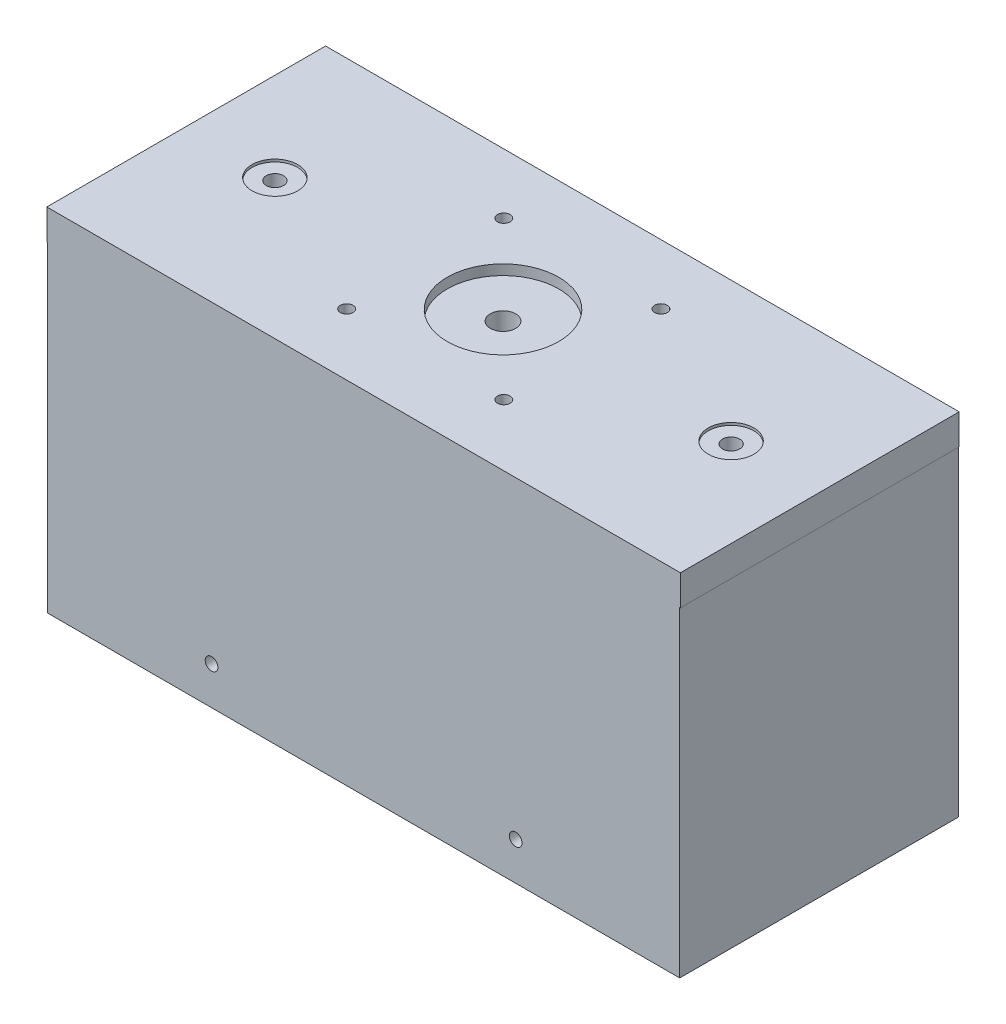
ISO-10303-21;
HEADER;
FILE_DESCRIPTION(('STEP AP214'),'2;1');
FILE_NAME('part.step','',(''),(''),'','','');
FILE_SCHEMA(('AUTOMOTIVE_DESIGN { 1 0 10303 214 1 1 1 1 }'));
ENDSEC;
DATA;
#1=APPLICATION_CONTEXT('core data for automotive mechanical design processes');
#2=APPLICATION_PROTOCOL_DEFINITION('international standard','automotive_design',2000,#1);
#3=PRODUCT_CONTEXT('',#1,'mechanical');
#4=PRODUCT('Part','Part','',(#3));
#5=PRODUCT_RELATED_PRODUCT_CATEGORY('part','',(#4));
#6=PRODUCT_DEFINITION_FORMATION('','',#4);
#7=PRODUCT_DEFINITION_CONTEXT('part definition',#1,'design');
#8=PRODUCT_DEFINITION('design','',#6,#7);
#9=PRODUCT_DEFINITION_SHAPE('','',#8);
#10=(LENGTH_UNIT() NAMED_UNIT(*) SI_UNIT(.MILLI.,.METRE.));
#11=(NAMED_UNIT(*) PLANE_ANGLE_UNIT() SI_UNIT($,.RADIAN.));
#12=(NAMED_UNIT(*) SI_UNIT($,.STERADIAN.) SOLID_ANGLE_UNIT());
#13=UNCERTAINTY_MEASURE_WITH_UNIT(LENGTH_MEASURE(1.E-05),#10,'distance_accuracy_value','');
#14=(GEOMETRIC_REPRESENTATION_CONTEXT(3) GLOBAL_UNCERTAINTY_ASSIGNED_CONTEXT((#13)) GLOBAL_UNIT_ASSIGNED_CONTEXT((#10,
#11,#12)) REPRESENTATION_CONTEXT('',''));
#15=CARTESIAN_POINT('',(0.,0.,0.));
#16=DIRECTION('',(0.,0.,1.));
#17=DIRECTION('',(1.,0.,0.));
#18=AXIS2_PLACEMENT_3D('',#15,#16,#17);
#19=CARTESIAN_POINT('',(-62.5,6.,27.5));
#20=DIRECTION('',(0.,0.,-1.));
#21=DIRECTION('',(-1.,0.,0.));
#22=AXIS2_PLACEMENT_3D('',#19,#20,#21);
#23=PLANE('',#22);
#24=DIRECTION('',(1.,0.,0.));
#25=VECTOR('',#24,1.);
#26=CARTESIAN_POINT('',(-62.5,0.,27.5));
#27=LINE('',#26,#25);
#28=CARTESIAN_POINT('',(-62.5,0.,27.5));
#29=VERTEX_POINT('',#28);
#30=CARTESIAN_POINT('',(-62.3619957512327,0.,27.5));
#31=VERTEX_POINT('',#30);
#32=EDGE_CURVE('E231',#29,#31,#27,.T.);
#33=ORIENTED_EDGE('',*,*,#32,.T.);
#34=DIRECTION('',(0.,1.,0.));
#35=VECTOR('',#34,1.);
#36=CARTESIAN_POINT('',(-62.3619957512327,-63.3064191724175,27.5));
#37=LINE('',#36,#35);
#38=CARTESIAN_POINT('',(-62.3619957512327,-63.3064191724175,27.5));
#39=VERTEX_POINT('',#38);
#40=EDGE_CURVE('E183',#39,#31,#37,.T.);
#41=ORIENTED_EDGE('',*,*,#40,.F.);
#42=DIRECTION('',(-1.,0.,0.));
#43=VECTOR('',#42,1.);
#44=CARTESIAN_POINT('',(62.3619957512328,-63.3064191724175,27.5));
#45=LINE('',#44,#43);
#46=CARTESIAN_POINT('',(62.3619957512328,-63.3064191724175,27.5));
#47=VERTEX_POINT('',#46);
#48=EDGE_CURVE('E181',#47,#39,#45,.T.);
#49=ORIENTED_EDGE('',*,*,#48,.F.);
#50=DIRECTION('',(0.,1.,0.));
#51=VECTOR('',#50,1.);
#52=CARTESIAN_POINT('',(62.3619957512328,-63.3064191724175,27.5));
#53=LINE('',#52,#51);
#54=CARTESIAN_POINT('',(62.3619957512328,0.,27.5));
#55=VERTEX_POINT('',#54);
#56=EDGE_CURVE('E190',#47,#55,#53,.T.);
#57=ORIENTED_EDGE('',*,*,#56,.T.);
#58=CARTESIAN_POINT('',(62.5,0.,27.5));
#59=VERTEX_POINT('',#58);
#60=EDGE_CURVE('E245',#55,#59,#27,.T.);
#61=ORIENTED_EDGE('',*,*,#60,.T.);
#62=DIRECTION('',(0.,-1.,0.));
#63=VECTOR('',#62,1.);
#64=CARTESIAN_POINT('',(62.5,6.,27.5));
#65=LINE('',#64,#63);
#66=CARTESIAN_POINT('',(62.5,6.,27.5));
#67=VERTEX_POINT('',#66);
#68=EDGE_CURVE('E237',#67,#59,#65,.T.);
#69=ORIENTED_EDGE('',*,*,#68,.F.);
#70=DIRECTION('',(1.,0.,0.));
#71=VECTOR('',#70,1.);
#72=CARTESIAN_POINT('',(-62.5,6.,27.5));
#73=LINE('',#72,#71);
#74=CARTESIAN_POINT('',(-62.5,6.,27.5));
#75=VERTEX_POINT('',#74);
#76=EDGE_CURVE('E235',#75,#67,#73,.T.);
#77=ORIENTED_EDGE('',*,*,#76,.F.);
#78=DIRECTION('',(0.,-1.,0.));
#79=VECTOR('',#78,1.);
#80=CARTESIAN_POINT('',(-62.5,6.,27.5));
#81=LINE('',#80,#79);
#82=EDGE_CURVE('E250',#75,#29,#81,.T.);
#83=ORIENTED_EDGE('',*,*,#82,.T.);
#84=EDGE_LOOP('',(#33,#41,#49,#57,#61,#69,#77,#83));
#85=FACE_BOUND('',#84,.T.);
#86=CARTESIAN_POINT('',(-30.,-55.8064191724175,27.5));
#87=DIRECTION('',(0.,0.,1.));
#88=DIRECTION('',(1.,0.,0.));
#89=AXIS2_PLACEMENT_3D('',#86,#87,#88);
#90=CIRCLE('',#89,1.24999999999999);
#91=CARTESIAN_POINT('',(-28.75,-55.8064191724175,27.5));
#92=VERTEX_POINT('',#91);
#93=EDGE_CURVE('E283',#92,#92,#90,.T.);
#94=ORIENTED_EDGE('',*,*,#93,.F.);
#95=EDGE_LOOP('',(#94));
#96=FACE_BOUND('',#95,.T.);
#97=CARTESIAN_POINT('',(30.,-55.8064191724175,27.5));
#98=DIRECTION('',(0.,0.,1.));
#99=DIRECTION('',(1.,0.,0.));
#100=AXIS2_PLACEMENT_3D('',#97,#98,#99);
#101=CIRCLE('',#100,1.24999999999999);
#102=CARTESIAN_POINT('',(31.25,-55.8064191724175,27.5));
#103=VERTEX_POINT('',#102);
#104=EDGE_CURVE('E264',#103,#103,#101,.T.);
#105=ORIENTED_EDGE('',*,*,#104,.F.);
#106=EDGE_LOOP('',(#105));
#107=FACE_BOUND('',#106,.T.);
#108=ADVANCED_FACE('F39',(#85,#96,#107),#23,.F.);
#109=CARTESIAN_POINT('',(-62.5,6.,-27.5));
#110=DIRECTION('',(0.,0.,1.));
#111=DIRECTION('',(1.,0.,0.));
#112=AXIS2_PLACEMENT_3D('',#109,#110,#111);
#113=PLANE('',#112);
#114=DIRECTION('',(-1.,0.,0.));
#115=VECTOR('',#114,1.);
#116=CARTESIAN_POINT('',(-62.5,0.,-27.5));
#117=LINE('',#116,#115);
#118=CARTESIAN_POINT('',(62.5,0.,-27.5));
#119=VERTEX_POINT('',#118);
#120=CARTESIAN_POINT('',(62.3619957512328,0.,-27.5));
#121=VERTEX_POINT('',#120);
#122=EDGE_CURVE('E240',#119,#121,#117,.T.);
#123=ORIENTED_EDGE('',*,*,#122,.T.);
#124=DIRECTION('',(0.,1.,0.));
#125=VECTOR('',#124,1.);
#126=CARTESIAN_POINT('',(62.3619957512328,-63.3064191724175,-27.5));
#127=LINE('',#126,#125);
#128=CARTESIAN_POINT('',(62.3619957512328,-63.3064191724175,-27.5));
#129=VERTEX_POINT('',#128);
#130=EDGE_CURVE('E193',#129,#121,#127,.T.);
#131=ORIENTED_EDGE('',*,*,#130,.F.);
#132=DIRECTION('',(1.,0.,0.));
#133=VECTOR('',#132,1.);
#134=CARTESIAN_POINT('',(62.3619957512328,-63.3064191724175,-27.5));
#135=LINE('',#134,#133);
#136=CARTESIAN_POINT('',(-62.3619957512327,-63.3064191724175,-27.5));
#137=VERTEX_POINT('',#136);
#138=EDGE_CURVE('E176',#137,#129,#135,.T.);
#139=ORIENTED_EDGE('',*,*,#138,.F.);
#140=DIRECTION('',(0.,1.,0.));
#141=VECTOR('',#140,1.);
#142=CARTESIAN_POINT('',(-62.3619957512327,-63.3064191724175,-27.5));
#143=LINE('',#142,#141);
#144=CARTESIAN_POINT('',(-62.3619957512327,0.,-27.5));
#145=VERTEX_POINT('',#144);
#146=EDGE_CURVE('E196',#137,#145,#143,.T.);
#147=ORIENTED_EDGE('',*,*,#146,.T.);
#148=CARTESIAN_POINT('',(-62.5,0.,-27.5));
#149=VERTEX_POINT('',#148);
#150=EDGE_CURVE('E64',#145,#149,#117,.T.);
#151=ORIENTED_EDGE('',*,*,#150,.T.);
#152=DIRECTION('',(0.,-1.,0.));
#153=VECTOR('',#152,1.);
#154=CARTESIAN_POINT('',(-62.5,6.,-27.5));
#155=LINE('',#154,#153);
#156=CARTESIAN_POINT('',(-62.5,6.,-27.5));
#157=VERTEX_POINT('',#156);
#158=EDGE_CURVE('E48',#157,#149,#155,.T.);
#159=ORIENTED_EDGE('',*,*,#158,.F.);
#160=DIRECTION('',(-1.,0.,0.));
#161=VECTOR('',#160,1.);
#162=CARTESIAN_POINT('',(-62.5,6.,-27.5));
#163=LINE('',#162,#161);
#164=CARTESIAN_POINT('',(62.5,6.,-27.5));
#165=VERTEX_POINT('',#164);
#166=EDGE_CURVE('E230',#165,#157,#163,.T.);
#167=ORIENTED_EDGE('',*,*,#166,.F.);
#168=DIRECTION('',(0.,-1.,0.));
#169=VECTOR('',#168,1.);
#170=CARTESIAN_POINT('',(62.5,6.,-27.5));
#171=LINE('',#170,#169);
#172=EDGE_CURVE('E11',#165,#119,#171,.T.);
#173=ORIENTED_EDGE('',*,*,#172,.T.);
#174=EDGE_LOOP('',(#123,#131,#139,#147,#151,#159,#167,#173));
#175=FACE_BOUND('',#174,.T.);
#176=CARTESIAN_POINT('',(30.,-55.8064191724175,-27.5));
#177=DIRECTION('',(0.,0.,-1.));
#178=DIRECTION('',(-1.,0.,0.));
#179=AXIS2_PLACEMENT_3D('',#176,#177,#178);
#180=CIRCLE('',#179,1.24999999999999);
#181=CARTESIAN_POINT('',(28.75,-55.8064191724175,-27.5));
#182=VERTEX_POINT('',#181);
#183=EDGE_CURVE('E295',#182,#182,#180,.T.);
#184=ORIENTED_EDGE('',*,*,#183,.F.);
#185=EDGE_LOOP('',(#184));
#186=FACE_BOUND('',#185,.T.);
#187=CARTESIAN_POINT('',(-30.,-55.8064191724175,-27.5));
#188=DIRECTION('',(0.,0.,-1.));
#189=DIRECTION('',(-1.,0.,0.));
#190=AXIS2_PLACEMENT_3D('',#187,#188,#189);
#191=CIRCLE('',#190,1.24999999999999);
#192=CARTESIAN_POINT('',(-31.25,-55.8064191724175,-27.5));
#193=VERTEX_POINT('',#192);
#194=EDGE_CURVE('E289',#193,#193,#191,.T.);
#195=ORIENTED_EDGE('',*,*,#194,.F.);
#196=EDGE_LOOP('',(#195));
#197=FACE_BOUND('',#196,.T.);
#198=ADVANCED_FACE('F317',(#175,#186,#197),#113,.F.);
#199=CARTESIAN_POINT('',(0.,0.,0.));
#200=DIRECTION('',(0.,1.,0.));
#201=DIRECTION('',(0.,0.,1.));
#202=AXIS2_PLACEMENT_3D('',#199,#200,#201);
#203=PLANE('',#202);
#204=DIRECTION('',(0.,0.,-1.));
#205=VECTOR('',#204,1.);
#206=CARTESIAN_POINT('',(-62.3619957512327,0.,-27.5));
#207=LINE('',#206,#205);
#208=EDGE_CURVE('E147',#31,#145,#207,.T.);
#209=ORIENTED_EDGE('',*,*,#208,.F.);
#210=ORIENTED_EDGE('',*,*,#32,.F.);
#211=DIRECTION('',(0.,0.,1.));
#212=VECTOR('',#211,1.);
#213=CARTESIAN_POINT('',(-62.5,0.,-27.5));
#214=LINE('',#213,#212);
#215=EDGE_CURVE('E243',#149,#29,#214,.T.);
#216=ORIENTED_EDGE('',*,*,#215,.F.);
#217=ORIENTED_EDGE('',*,*,#150,.F.);
#218=EDGE_LOOP('',(#209,#210,#216,#217));
#219=FACE_BOUND('',#218,.T.);
#220=ADVANCED_FACE('F323',(#219),#203,.F.);
#221=DIRECTION('',(0.,0.,1.));
#222=VECTOR('',#221,1.);
#223=CARTESIAN_POINT('',(62.3619957512328,0.,-27.5));
#224=LINE('',#223,#222);
#225=EDGE_CURVE('E177',#121,#55,#224,.T.);
#226=ORIENTED_EDGE('',*,*,#225,.F.);
#227=ORIENTED_EDGE('',*,*,#122,.F.);
#228=DIRECTION('',(0.,0.,-1.));
#229=VECTOR('',#228,1.);
#230=CARTESIAN_POINT('',(62.5,0.,-27.5));
#231=LINE('',#230,#229);
#232=EDGE_CURVE('E224',#59,#119,#231,.T.);
#233=ORIENTED_EDGE('',*,*,#232,.F.);
#234=ORIENTED_EDGE('',*,*,#60,.F.);
#235=EDGE_LOOP('',(#226,#227,#233,#234));
#236=FACE_BOUND('',#235,.T.);
#237=ADVANCED_FACE('F339',(#236),#203,.F.);
#238=CARTESIAN_POINT('',(62.5,6.,-27.5));
#239=DIRECTION('',(-1.,0.,0.));
#240=DIRECTION('',(0.,0.,1.));
#241=AXIS2_PLACEMENT_3D('',#238,#239,#240);
#242=PLANE('',#241);
#243=ORIENTED_EDGE('',*,*,#232,.T.);
#244=ORIENTED_EDGE('',*,*,#172,.F.);
#245=DIRECTION('',(0.,0.,-1.));
#246=VECTOR('',#245,1.);
#247=CARTESIAN_POINT('',(62.5,6.,-27.5));
#248=LINE('',#247,#246);
#249=EDGE_CURVE('E227',#67,#165,#248,.T.);
#250=ORIENTED_EDGE('',*,*,#249,.F.);
#251=ORIENTED_EDGE('',*,*,#68,.T.);
#252=EDGE_LOOP('',(#243,#244,#250,#251));
#253=FACE_BOUND('',#252,.T.);
#254=ADVANCED_FACE('F41',(#253),#242,.F.);
#255=CARTESIAN_POINT('',(-62.5,6.,-27.5));
#256=DIRECTION('',(1.,0.,0.));
#257=DIRECTION('',(0.,0.,-1.));
#258=AXIS2_PLACEMENT_3D('',#255,#256,#257);
#259=PLANE('',#258);
#260=ORIENTED_EDGE('',*,*,#215,.T.);
#261=ORIENTED_EDGE('',*,*,#82,.F.);
#262=DIRECTION('',(0.,0.,1.));
#263=VECTOR('',#262,1.);
#264=CARTESIAN_POINT('',(-62.5,6.,-27.5));
#265=LINE('',#264,#263);
#266=EDGE_CURVE('E233',#157,#75,#265,.T.);
#267=ORIENTED_EDGE('',*,*,#266,.F.);
#268=ORIENTED_EDGE('',*,*,#158,.T.);
#269=EDGE_LOOP('',(#260,#261,#267,#268));
#270=FACE_BOUND('',#269,.T.);
#271=ADVANCED_FACE('F330',(#270),#259,.F.);
#272=CARTESIAN_POINT('',(0.,6.,0.));
#273=DIRECTION('',(0.,1.,0.));
#274=DIRECTION('',(0.,0.,1.));
#275=AXIS2_PLACEMENT_3D('',#272,#273,#274);
#276=PLANE('',#275);
#277=CARTESIAN_POINT('',(-45.,6.,0.));
#278=DIRECTION('',(0.,1.,0.));
#279=DIRECTION('',(0.,0.,1.));
#280=AXIS2_PLACEMENT_3D('',#277,#278,#279);
#281=CIRCLE('',#280,4.49999999999999);
#282=CARTESIAN_POINT('',(-45.,6.,4.5));
#283=VERTEX_POINT('',#282);
#284=EDGE_CURVE('E695',#283,#283,#281,.T.);
#285=ORIENTED_EDGE('',*,*,#284,.F.);
#286=EDGE_LOOP('',(#285));
#287=FACE_BOUND('',#286,.T.);
#288=CARTESIAN_POINT('',(45.,6.,0.));
#289=DIRECTION('',(0.,1.,0.));
#290=DIRECTION('',(0.,0.,1.));
#291=AXIS2_PLACEMENT_3D('',#288,#289,#290);
#292=CIRCLE('',#291,4.49999999999999);
#293=CARTESIAN_POINT('',(45.,6.,4.49999999999999));
#294=VERTEX_POINT('',#293);
#295=EDGE_CURVE('E705',#294,#294,#292,.T.);
#296=ORIENTED_EDGE('',*,*,#295,.F.);
#297=EDGE_LOOP('',(#296));
#298=FACE_BOUND('',#297,.T.);
#299=CARTESIAN_POINT('',(15.5,6.,-15.657432452083));
#300=DIRECTION('',(0.,1.,0.));
#301=DIRECTION('',(0.,0.,1.));
#302=AXIS2_PLACEMENT_3D('',#299,#300,#301);
#303=CIRCLE('',#302,1.24999999999999);
#304=CARTESIAN_POINT('',(15.5,6.,-14.407432452083));
#305=VERTEX_POINT('',#304);
#306=EDGE_CURVE('E198',#305,#305,#303,.T.);
#307=ORIENTED_EDGE('',*,*,#306,.F.);
#308=EDGE_LOOP('',(#307));
#309=FACE_BOUND('',#308,.T.);
#310=CARTESIAN_POINT('',(15.5,6.,15.342567547917));
#311=DIRECTION('',(0.,1.,0.));
#312=DIRECTION('',(0.,0.,1.));
#313=AXIS2_PLACEMENT_3D('',#310,#311,#312);
#314=CIRCLE('',#313,1.24999999999999);
#315=CARTESIAN_POINT('',(15.5,6.,16.592567547917));
#316=VERTEX_POINT('',#315);
#317=EDGE_CURVE('E202',#316,#316,#314,.T.);
#318=ORIENTED_EDGE('',*,*,#317,.F.);
#319=EDGE_LOOP('',(#318));
#320=FACE_BOUND('',#319,.T.);
#321=CARTESIAN_POINT('',(-15.5,6.,15.342567547917));
#322=DIRECTION('',(0.,1.,0.));
#323=DIRECTION('',(0.,0.,1.));
#324=AXIS2_PLACEMENT_3D('',#321,#322,#323);
#325=CIRCLE('',#324,1.24999999999999);
#326=CARTESIAN_POINT('',(-15.5,6.,16.592567547917));
#327=VERTEX_POINT('',#326);
#328=EDGE_CURVE('E206',#327,#327,#325,.T.);
#329=ORIENTED_EDGE('',*,*,#328,.F.);
#330=EDGE_LOOP('',(#329));
#331=FACE_BOUND('',#330,.T.);
#332=CARTESIAN_POINT('',(-15.5,6.,-15.657432452083));
#333=DIRECTION('',(0.,1.,0.));
#334=DIRECTION('',(0.,0.,1.));
#335=AXIS2_PLACEMENT_3D('',#332,#333,#334);
#336=CIRCLE('',#335,1.24999999999999);
#337=CARTESIAN_POINT('',(-15.5,6.,-14.407432452083));
#338=VERTEX_POINT('',#337);
#339=EDGE_CURVE('E210',#338,#338,#336,.T.);
#340=ORIENTED_EDGE('',*,*,#339,.F.);
#341=EDGE_LOOP('',(#340));
#342=FACE_BOUND('',#341,.T.);
#343=CARTESIAN_POINT('',(0.,6.,0.));
#344=DIRECTION('',(0.,1.,0.));
#345=DIRECTION('',(0.,0.,1.));
#346=AXIS2_PLACEMENT_3D('',#343,#344,#345);
#347=CIRCLE('',#346,11.);
#348=CARTESIAN_POINT('',(0.,6.,11.));
#349=VERTEX_POINT('',#348);
#350=EDGE_CURVE('E220',#349,#349,#347,.T.);
#351=ORIENTED_EDGE('',*,*,#350,.F.);
#352=EDGE_LOOP('',(#351));
#353=FACE_BOUND('',#352,.T.);
#354=ORIENTED_EDGE('',*,*,#249,.T.);
#355=ORIENTED_EDGE('',*,*,#166,.T.);
#356=ORIENTED_EDGE('',*,*,#266,.T.);
#357=ORIENTED_EDGE('',*,*,#76,.T.);
#358=EDGE_LOOP('',(#354,#355,#356,#357));
#359=FACE_BOUND('',#358,.T.);
#360=ADVANCED_FACE('F332',(#287,#298,#309,#320,#331,#342,#353,#359),#276,.T.);
#361=CARTESIAN_POINT('',(-45.,0.,0.));
#362=DIRECTION('',(0.,1.,0.));
#363=DIRECTION('',(0.,0.,1.));
#364=AXIS2_PLACEMENT_3D('',#361,#362,#363);
#365=CIRCLE('',#364,0.0357205176494837);
#366=CARTESIAN_POINT('',(-45.,0.,0.0357205176494893));
#367=VERTEX_POINT('',#366);
#368=EDGE_CURVE('E43',#367,#367,#365,.T.);
#369=ORIENTED_EDGE('',*,*,#368,.T.);
#370=EDGE_LOOP('',(#369));
#371=FACE_BOUND('',#370,.T.);
#372=CARTESIAN_POINT('',(45.,0.,0.));
#373=DIRECTION('',(0.,1.,0.));
#374=DIRECTION('',(0.,0.,1.));
#375=AXIS2_PLACEMENT_3D('',#372,#373,#374);
#376=CIRCLE('',#375,0.0357205176494837);
#377=CARTESIAN_POINT('',(45.,0.,0.0357205176494838));
#378=VERTEX_POINT('',#377);
#379=EDGE_CURVE('E262',#378,#378,#376,.T.);
#380=ORIENTED_EDGE('',*,*,#379,.T.);
#381=EDGE_LOOP('',(#380));
#382=FACE_BOUND('',#381,.T.);
#383=DIRECTION('',(-1.,0.,0.));
#384=VECTOR('',#383,1.);
#385=CARTESIAN_POINT('',(60.,0.,24.842567547917));
#386=LINE('',#385,#384);
#387=CARTESIAN_POINT('',(60.,0.,24.842567547917));
#388=VERTEX_POINT('',#387);
#389=CARTESIAN_POINT('',(-60.,0.,24.842567547917));
#390=VERTEX_POINT('',#389);
#391=EDGE_CURVE('E140',#388,#390,#386,.T.);
#392=ORIENTED_EDGE('',*,*,#391,.T.);
#393=DIRECTION('',(0.,0.,-1.));
#394=VECTOR('',#393,1.);
#395=CARTESIAN_POINT('',(-60.,0.,-24.842567547917));
#396=LINE('',#395,#394);
#397=CARTESIAN_POINT('',(-60.,0.,-24.842567547917));
#398=VERTEX_POINT('',#397);
#399=EDGE_CURVE('E160',#390,#398,#396,.T.);
#400=ORIENTED_EDGE('',*,*,#399,.T.);
#401=DIRECTION('',(1.,0.,0.));
#402=VECTOR('',#401,1.);
#403=CARTESIAN_POINT('',(60.,0.,-24.842567547917));
#404=LINE('',#403,#402);
#405=CARTESIAN_POINT('',(60.,0.,-24.842567547917));
#406=VERTEX_POINT('',#405);
#407=EDGE_CURVE('E146',#398,#406,#404,.T.);
#408=ORIENTED_EDGE('',*,*,#407,.T.);
#409=DIRECTION('',(0.,0.,1.));
#410=VECTOR('',#409,1.);
#411=CARTESIAN_POINT('',(60.,0.,-24.842567547917));
#412=LINE('',#411,#410);
#413=EDGE_CURVE('E164',#406,#388,#412,.T.);
#414=ORIENTED_EDGE('',*,*,#413,.T.);
#415=EDGE_LOOP('',(#392,#400,#408,#414));
#416=FACE_BOUND('',#415,.T.);
#417=CARTESIAN_POINT('',(15.5,0.,-15.657432452083));
#418=DIRECTION('',(0.,1.,0.));
#419=DIRECTION('',(0.,0.,1.));
#420=AXIS2_PLACEMENT_3D('',#417,#418,#419);
#421=CIRCLE('',#420,1.24999999999999);
#422=CARTESIAN_POINT('',(15.5,0.,-14.407432452083));
#423=VERTEX_POINT('',#422);
#424=EDGE_CURVE('E201',#423,#423,#421,.T.);
#425=ORIENTED_EDGE('',*,*,#424,.T.);
#426=EDGE_LOOP('',(#425));
#427=FACE_BOUND('',#426,.T.);
#428=CARTESIAN_POINT('',(15.5,0.,15.342567547917));
#429=DIRECTION('',(0.,1.,0.));
#430=DIRECTION('',(0.,0.,1.));
#431=AXIS2_PLACEMENT_3D('',#428,#429,#430);
#432=CIRCLE('',#431,1.24999999999999);
#433=CARTESIAN_POINT('',(15.5,0.,16.592567547917));
#434=VERTEX_POINT('',#433);
#435=EDGE_CURVE('E205',#434,#434,#432,.T.);
#436=ORIENTED_EDGE('',*,*,#435,.T.);
#437=EDGE_LOOP('',(#436));
#438=FACE_BOUND('',#437,.T.);
#439=CARTESIAN_POINT('',(-15.5,0.,15.342567547917));
#440=DIRECTION('',(0.,1.,0.));
#441=DIRECTION('',(0.,0.,1.));
#442=AXIS2_PLACEMENT_3D('',#439,#440,#441);
#443=CIRCLE('',#442,1.24999999999999);
#444=CARTESIAN_POINT('',(-15.5,0.,16.592567547917));
#445=VERTEX_POINT('',#444);
#446=EDGE_CURVE('E209',#445,#445,#443,.T.);
#447=ORIENTED_EDGE('',*,*,#446,.T.);
#448=EDGE_LOOP('',(#447));
#449=FACE_BOUND('',#448,.T.);
#450=CARTESIAN_POINT('',(-15.5,0.,-15.657432452083));
#451=DIRECTION('',(0.,1.,0.));
#452=DIRECTION('',(0.,0.,1.));
#453=AXIS2_PLACEMENT_3D('',#450,#451,#452);
#454=CIRCLE('',#453,1.24999999999999);
#455=CARTESIAN_POINT('',(-15.5,0.,-14.407432452083));
#456=VERTEX_POINT('',#455);
#457=EDGE_CURVE('E213',#456,#456,#454,.T.);
#458=ORIENTED_EDGE('',*,*,#457,.T.);
#459=EDGE_LOOP('',(#458));
#460=FACE_BOUND('',#459,.T.);
#461=CARTESIAN_POINT('',(0.,0.,0.));
#462=DIRECTION('',(0.,1.,0.));
#463=DIRECTION('',(0.,0.,1.));
#464=AXIS2_PLACEMENT_3D('',#461,#462,#463);
#465=CIRCLE('',#464,2.5);
#466=CARTESIAN_POINT('',(0.,0.,2.5));
#467=VERTEX_POINT('',#466);
#468=EDGE_CURVE('E217',#467,#467,#465,.F.);
#469=ORIENTED_EDGE('',*,*,#468,.F.);
#470=EDGE_LOOP('',(#469));
#471=FACE_BOUND('',#470,.T.);
#472=ADVANCED_FACE('F328',(#371,#382,#416,#427,#438,#449,#460,#471),#203,.F.);
#473=CARTESIAN_POINT('',(0.,4.,0.));
#474=DIRECTION('',(0.,1.,0.));
#475=DIRECTION('',(0.,0.,1.));
#476=AXIS2_PLACEMENT_3D('',#473,#474,#475);
#477=CYLINDRICAL_SURFACE('',#476,11.);
#478=CARTESIAN_POINT('',(0.,4.,0.));
#479=DIRECTION('',(0.,1.,0.));
#480=DIRECTION('',(0.,0.,1.));
#481=AXIS2_PLACEMENT_3D('',#478,#479,#480);
#482=CIRCLE('',#481,11.);
#483=CARTESIAN_POINT('',(0.,4.,11.));
#484=VERTEX_POINT('',#483);
#485=EDGE_CURVE('E221',#484,#484,#482,.T.);
#486=ORIENTED_EDGE('',*,*,#485,.F.);
#487=EDGE_LOOP('',(#486));
#488=FACE_BOUND('',#487,.T.);
#489=ORIENTED_EDGE('',*,*,#350,.T.);
#490=EDGE_LOOP('',(#489));
#491=FACE_BOUND('',#490,.T.);
#492=ADVANCED_FACE('F395',(#488,#491),#477,.F.);
#493=CARTESIAN_POINT('',(0.,4.,0.));
#494=DIRECTION('',(0.,1.,0.));
#495=DIRECTION('',(0.,0.,1.));
#496=AXIS2_PLACEMENT_3D('',#493,#494,#495);
#497=PLANE('',#496);
#498=CARTESIAN_POINT('',(0.,4.,0.));
#499=DIRECTION('',(0.,1.,0.));
#500=DIRECTION('',(0.,0.,1.));
#501=AXIS2_PLACEMENT_3D('',#498,#499,#500);
#502=CIRCLE('',#501,2.5);
#503=CARTESIAN_POINT('',(0.,4.,2.5));
#504=VERTEX_POINT('',#503);
#505=EDGE_CURVE('E214',#504,#504,#502,.T.);
#506=ORIENTED_EDGE('',*,*,#505,.F.);
#507=EDGE_LOOP('',(#506));
#508=FACE_BOUND('',#507,.T.);
#509=ORIENTED_EDGE('',*,*,#485,.T.);
#510=EDGE_LOOP('',(#509));
#511=FACE_BOUND('',#510,.T.);
#512=ADVANCED_FACE('F410',(#508,#511),#497,.T.);
#513=CARTESIAN_POINT('',(0.,-0.00100000000000013,0.));
#514=DIRECTION('',(0.,1.,0.));
#515=DIRECTION('',(0.,0.,1.));
#516=AXIS2_PLACEMENT_3D('',#513,#514,#515);
#517=CYLINDRICAL_SURFACE('',#516,2.5);
#518=ORIENTED_EDGE('',*,*,#505,.T.);
#519=EDGE_LOOP('',(#518));
#520=FACE_BOUND('',#519,.T.);
#521=ORIENTED_EDGE('',*,*,#468,.T.);
#522=EDGE_LOOP('',(#521));
#523=FACE_BOUND('',#522,.T.);
#524=ADVANCED_FACE('F407',(#520,#523),#517,.F.);
#525=CARTESIAN_POINT('',(-15.5,6.,-15.657432452083));
#526=DIRECTION('',(0.,1.,0.));
#527=DIRECTION('',(0.,0.,1.));
#528=AXIS2_PLACEMENT_3D('',#525,#526,#527);
#529=CYLINDRICAL_SURFACE('',#528,1.24999999999999);
#530=ORIENTED_EDGE('',*,*,#339,.T.);
#531=EDGE_LOOP('',(#530));
#532=FACE_BOUND('',#531,.T.);
#533=ORIENTED_EDGE('',*,*,#457,.F.);
#534=EDGE_LOOP('',(#533));
#535=FACE_BOUND('',#534,.T.);
#536=ADVANCED_FACE('F409',(#532,#535),#529,.F.);
#537=CARTESIAN_POINT('',(-15.5,6.,15.342567547917));
#538=DIRECTION('',(0.,1.,0.));
#539=DIRECTION('',(0.,0.,1.));
#540=AXIS2_PLACEMENT_3D('',#537,#538,#539);
#541=CYLINDRICAL_SURFACE('',#540,1.24999999999999);
#542=ORIENTED_EDGE('',*,*,#328,.T.);
#543=EDGE_LOOP('',(#542));
#544=FACE_BOUND('',#543,.T.);
#545=ORIENTED_EDGE('',*,*,#446,.F.);
#546=EDGE_LOOP('',(#545));
#547=FACE_BOUND('',#546,.T.);
#548=ADVANCED_FACE('F417',(#544,#547),#541,.F.);
#549=CARTESIAN_POINT('',(15.5,6.,15.342567547917));
#550=DIRECTION('',(0.,1.,0.));
#551=DIRECTION('',(0.,0.,1.));
#552=AXIS2_PLACEMENT_3D('',#549,#550,#551);
#553=CYLINDRICAL_SURFACE('',#552,1.24999999999999);
#554=ORIENTED_EDGE('',*,*,#317,.T.);
#555=EDGE_LOOP('',(#554));
#556=FACE_BOUND('',#555,.T.);
#557=ORIENTED_EDGE('',*,*,#435,.F.);
#558=EDGE_LOOP('',(#557));
#559=FACE_BOUND('',#558,.T.);
#560=ADVANCED_FACE('F461',(#556,#559),#553,.F.);
#561=CARTESIAN_POINT('',(15.5,6.,-15.657432452083));
#562=DIRECTION('',(0.,1.,0.));
#563=DIRECTION('',(0.,0.,1.));
#564=AXIS2_PLACEMENT_3D('',#561,#562,#563);
#565=CYLINDRICAL_SURFACE('',#564,1.24999999999999);
#566=ORIENTED_EDGE('',*,*,#306,.T.);
#567=EDGE_LOOP('',(#566));
#568=FACE_BOUND('',#567,.T.);
#569=ORIENTED_EDGE('',*,*,#424,.F.);
#570=EDGE_LOOP('',(#569));
#571=FACE_BOUND('',#570,.T.);
#572=ADVANCED_FACE('F472',(#568,#571),#565,.F.);
#573=CARTESIAN_POINT('',(0.,-63.3064191724175,0.));
#574=DIRECTION('',(0.,-1.,0.));
#575=DIRECTION('',(0.,0.,-1.));
#576=AXIS2_PLACEMENT_3D('',#573,#574,#575);
#577=PLANE('',#576);
#578=DIRECTION('',(0.,0.,-1.));
#579=VECTOR('',#578,1.);
#580=CARTESIAN_POINT('',(-62.3619957512327,-63.3064191724175,-27.5));
#581=LINE('',#580,#579);
#582=EDGE_CURVE('E173',#39,#137,#581,.T.);
#583=ORIENTED_EDGE('',*,*,#582,.T.);
#584=ORIENTED_EDGE('',*,*,#138,.T.);
#585=DIRECTION('',(0.,0.,1.));
#586=VECTOR('',#585,1.);
#587=CARTESIAN_POINT('',(62.3619957512328,-63.3064191724175,-27.5));
#588=LINE('',#587,#586);
#589=EDGE_CURVE('E179',#129,#47,#588,.T.);
#590=ORIENTED_EDGE('',*,*,#589,.T.);
#591=ORIENTED_EDGE('',*,*,#48,.T.);
#592=EDGE_LOOP('',(#583,#584,#590,#591));
#593=FACE_BOUND('',#592,.T.);
#594=DIRECTION('',(1.,0.,0.));
#595=VECTOR('',#594,1.);
#596=CARTESIAN_POINT('',(60.,-63.3064191724175,-24.842567547917));
#597=LINE('',#596,#595);
#598=CARTESIAN_POINT('',(-60.,-63.3064191724175,-24.842567547917));
#599=VERTEX_POINT('',#598);
#600=CARTESIAN_POINT('',(60.,-63.3064191724175,-24.842567547917));
#601=VERTEX_POINT('',#600);
#602=EDGE_CURVE('E139',#599,#601,#597,.T.);
#603=ORIENTED_EDGE('',*,*,#602,.F.);
#604=DIRECTION('',(0.,0.,-1.));
#605=VECTOR('',#604,1.);
#606=CARTESIAN_POINT('',(-60.,-63.3064191724175,-24.842567547917));
#607=LINE('',#606,#605);
#608=CARTESIAN_POINT('',(-60.,-63.3064191724175,24.842567547917));
#609=VERTEX_POINT('',#608);
#610=EDGE_CURVE('E131',#609,#599,#607,.T.);
#611=ORIENTED_EDGE('',*,*,#610,.F.);
#612=DIRECTION('',(-1.,0.,0.));
#613=VECTOR('',#612,1.);
#614=CARTESIAN_POINT('',(60.,-63.3064191724175,24.842567547917));
#615=LINE('',#614,#613);
#616=CARTESIAN_POINT('',(60.,-63.3064191724175,24.842567547917));
#617=VERTEX_POINT('',#616);
#618=EDGE_CURVE('E155',#617,#609,#615,.T.);
#619=ORIENTED_EDGE('',*,*,#618,.F.);
#620=DIRECTION('',(0.,0.,1.));
#621=VECTOR('',#620,1.);
#622=CARTESIAN_POINT('',(60.,-63.3064191724175,-24.842567547917));
#623=LINE('',#622,#621);
#624=EDGE_CURVE('E153',#601,#617,#623,.T.);
#625=ORIENTED_EDGE('',*,*,#624,.F.);
#626=EDGE_LOOP('',(#603,#611,#619,#625));
#627=FACE_BOUND('',#626,.T.);
#628=ADVANCED_FACE('F151',(#593,#627),#577,.T.);
#629=CARTESIAN_POINT('',(-62.3619957512327,-63.3064191724175,-27.5));
#630=DIRECTION('',(1.,0.,0.));
#631=DIRECTION('',(0.,0.,-1.));
#632=AXIS2_PLACEMENT_3D('',#629,#630,#631);
#633=PLANE('',#632);
#634=ORIENTED_EDGE('',*,*,#208,.T.);
#635=ORIENTED_EDGE('',*,*,#146,.F.);
#636=ORIENTED_EDGE('',*,*,#582,.F.);
#637=ORIENTED_EDGE('',*,*,#40,.T.);
#638=EDGE_LOOP('',(#634,#635,#636,#637));
#639=FACE_BOUND('',#638,.T.);
#640=ADVANCED_FACE('F350',(#639),#633,.F.);
#641=CARTESIAN_POINT('',(62.3619957512328,-63.3064191724175,-27.5));
#642=DIRECTION('',(-1.,0.,0.));
#643=DIRECTION('',(0.,0.,1.));
#644=AXIS2_PLACEMENT_3D('',#641,#642,#643);
#645=PLANE('',#644);
#646=ORIENTED_EDGE('',*,*,#225,.T.);
#647=ORIENTED_EDGE('',*,*,#56,.F.);
#648=ORIENTED_EDGE('',*,*,#589,.F.);
#649=ORIENTED_EDGE('',*,*,#130,.T.);
#650=EDGE_LOOP('',(#646,#647,#648,#649));
#651=FACE_BOUND('',#650,.T.);
#652=ADVANCED_FACE('F313',(#651),#645,.F.);
#653=CARTESIAN_POINT('',(-60.,-63.3064191724175,-24.842567547917));
#654=DIRECTION('',(1.,0.,0.));
#655=DIRECTION('',(0.,0.,-1.));
#656=AXIS2_PLACEMENT_3D('',#653,#654,#655);
#657=PLANE('',#656);
#658=ORIENTED_EDGE('',*,*,#399,.F.);
#659=DIRECTION('',(0.,1.,0.));
#660=VECTOR('',#659,1.);
#661=CARTESIAN_POINT('',(-60.,-63.3064191724175,24.842567547917));
#662=LINE('',#661,#660);
#663=EDGE_CURVE('E56',#609,#390,#662,.T.);
#664=ORIENTED_EDGE('',*,*,#663,.F.);
#665=ORIENTED_EDGE('',*,*,#610,.T.);
#666=DIRECTION('',(0.,1.,0.));
#667=VECTOR('',#666,1.);
#668=CARTESIAN_POINT('',(-60.,-63.3064191724175,-24.842567547917));
#669=LINE('',#668,#667);
#670=EDGE_CURVE('E134',#599,#398,#669,.T.);
#671=ORIENTED_EDGE('',*,*,#670,.T.);
#672=EDGE_LOOP('',(#658,#664,#665,#671));
#673=FACE_BOUND('',#672,.T.);
#674=ADVANCED_FACE('F133',(#673),#657,.T.);
#675=CARTESIAN_POINT('',(60.,-63.3064191724175,-24.842567547917));
#676=DIRECTION('',(0.,0.,1.));
#677=DIRECTION('',(1.,0.,0.));
#678=AXIS2_PLACEMENT_3D('',#675,#676,#677);
#679=PLANE('',#678);
#680=CARTESIAN_POINT('',(-30.,-55.8064191724175,-24.842567547917));
#681=DIRECTION('',(0.,0.,1.));
#682=DIRECTION('',(1.,0.,0.));
#683=AXIS2_PLACEMENT_3D('',#680,#681,#682);
#684=CIRCLE('',#683,1.24999999999999);
#685=CARTESIAN_POINT('',(-28.75,-55.8064191724175,-24.842567547917));
#686=VERTEX_POINT('',#685);
#687=EDGE_CURVE('E292',#686,#686,#684,.T.);
#688=ORIENTED_EDGE('',*,*,#687,.F.);
#689=EDGE_LOOP('',(#688));
#690=FACE_BOUND('',#689,.T.);
#691=CARTESIAN_POINT('',(30.,-55.8064191724175,-24.842567547917));
#692=DIRECTION('',(0.,0.,1.));
#693=DIRECTION('',(1.,0.,0.));
#694=AXIS2_PLACEMENT_3D('',#691,#692,#693);
#695=CIRCLE('',#694,1.24999999999999);
#696=CARTESIAN_POINT('',(31.25,-55.8064191724175,-24.842567547917));
#697=VERTEX_POINT('',#696);
#698=EDGE_CURVE('E162',#697,#697,#695,.T.);
#699=ORIENTED_EDGE('',*,*,#698,.F.);
#700=EDGE_LOOP('',(#699));
#701=FACE_BOUND('',#700,.T.);
#702=ORIENTED_EDGE('',*,*,#407,.F.);
#703=ORIENTED_EDGE('',*,*,#670,.F.);
#704=ORIENTED_EDGE('',*,*,#602,.T.);
#705=DIRECTION('',(0.,1.,0.));
#706=VECTOR('',#705,1.);
#707=CARTESIAN_POINT('',(60.,-63.3064191724175,-24.842567547917));
#708=LINE('',#707,#706);
#709=EDGE_CURVE('E148',#601,#406,#708,.T.);
#710=ORIENTED_EDGE('',*,*,#709,.T.);
#711=EDGE_LOOP('',(#702,#703,#704,#710));
#712=FACE_BOUND('',#711,.T.);
#713=ADVANCED_FACE('F143',(#690,#701,#712),#679,.T.);
#714=CARTESIAN_POINT('',(60.,-63.3064191724175,-24.842567547917));
#715=DIRECTION('',(-1.,0.,0.));
#716=DIRECTION('',(0.,0.,1.));
#717=AXIS2_PLACEMENT_3D('',#714,#715,#716);
#718=PLANE('',#717);
#719=ORIENTED_EDGE('',*,*,#413,.F.);
#720=ORIENTED_EDGE('',*,*,#709,.F.);
#721=ORIENTED_EDGE('',*,*,#624,.T.);
#722=DIRECTION('',(0.,1.,0.));
#723=VECTOR('',#722,1.);
#724=CARTESIAN_POINT('',(60.,-63.3064191724175,24.842567547917));
#725=LINE('',#724,#723);
#726=EDGE_CURVE('E170',#617,#388,#725,.T.);
#727=ORIENTED_EDGE('',*,*,#726,.T.);
#728=EDGE_LOOP('',(#719,#720,#721,#727));
#729=FACE_BOUND('',#728,.T.);
#730=ADVANCED_FACE('F303',(#729),#718,.T.);
#731=CARTESIAN_POINT('',(60.,-63.3064191724175,24.842567547917));
#732=DIRECTION('',(0.,0.,-1.));
#733=DIRECTION('',(-1.,0.,0.));
#734=AXIS2_PLACEMENT_3D('',#731,#732,#733);
#735=PLANE('',#734);
#736=CARTESIAN_POINT('',(30.,-55.8064191724175,24.842567547917));
#737=DIRECTION('',(0.,0.,-1.));
#738=DIRECTION('',(-1.,0.,0.));
#739=AXIS2_PLACEMENT_3D('',#736,#737,#738);
#740=CIRCLE('',#739,1.24999999999999);
#741=CARTESIAN_POINT('',(28.75,-55.8064191724175,24.842567547917));
#742=VERTEX_POINT('',#741);
#743=EDGE_CURVE('E269',#742,#742,#740,.T.);
#744=ORIENTED_EDGE('',*,*,#743,.F.);
#745=EDGE_LOOP('',(#744));
#746=FACE_BOUND('',#745,.T.);
#747=CARTESIAN_POINT('',(-30.,-55.8064191724175,24.842567547917));
#748=DIRECTION('',(0.,0.,-1.));
#749=DIRECTION('',(-1.,0.,0.));
#750=AXIS2_PLACEMENT_3D('',#747,#748,#749);
#751=CIRCLE('',#750,1.24999999999999);
#752=CARTESIAN_POINT('',(-31.25,-55.8064191724175,24.842567547917));
#753=VERTEX_POINT('',#752);
#754=EDGE_CURVE('E286',#753,#753,#751,.T.);
#755=ORIENTED_EDGE('',*,*,#754,.F.);
#756=EDGE_LOOP('',(#755));
#757=FACE_BOUND('',#756,.T.);
#758=ORIENTED_EDGE('',*,*,#391,.F.);
#759=ORIENTED_EDGE('',*,*,#726,.F.);
#760=ORIENTED_EDGE('',*,*,#618,.T.);
#761=ORIENTED_EDGE('',*,*,#663,.T.);
#762=EDGE_LOOP('',(#758,#759,#760,#761));
#763=FACE_BOUND('',#762,.T.);
#764=ADVANCED_FACE('F310',(#746,#757,#763),#735,.T.);
#765=CARTESIAN_POINT('',(30.,-55.8064191724175,-27.5));
#766=DIRECTION('',(0.,0.,-1.));
#767=DIRECTION('',(-1.,0.,0.));
#768=AXIS2_PLACEMENT_3D('',#765,#766,#767);
#769=CYLINDRICAL_SURFACE('',#768,1.24999999999999);
#770=ORIENTED_EDGE('',*,*,#183,.T.);
#771=EDGE_LOOP('',(#770));
#772=FACE_BOUND('',#771,.T.);
#773=ORIENTED_EDGE('',*,*,#698,.T.);
#774=EDGE_LOOP('',(#773));
#775=FACE_BOUND('',#774,.T.);
#776=ADVANCED_FACE('F300',(#772,#775),#769,.F.);
#777=CARTESIAN_POINT('',(-30.,-55.8064191724175,-27.5));
#778=DIRECTION('',(0.,0.,-1.));
#779=DIRECTION('',(-1.,0.,0.));
#780=AXIS2_PLACEMENT_3D('',#777,#778,#779);
#781=CYLINDRICAL_SURFACE('',#780,1.24999999999999);
#782=ORIENTED_EDGE('',*,*,#194,.T.);
#783=EDGE_LOOP('',(#782));
#784=FACE_BOUND('',#783,.T.);
#785=ORIENTED_EDGE('',*,*,#687,.T.);
#786=EDGE_LOOP('',(#785));
#787=FACE_BOUND('',#786,.T.);
#788=ADVANCED_FACE('F368',(#784,#787),#781,.F.);
#789=CARTESIAN_POINT('',(-30.,-55.8064191724175,27.5));
#790=DIRECTION('',(0.,0.,1.));
#791=DIRECTION('',(1.,0.,0.));
#792=AXIS2_PLACEMENT_3D('',#789,#790,#791);
#793=CYLINDRICAL_SURFACE('',#792,1.24999999999999);
#794=ORIENTED_EDGE('',*,*,#93,.T.);
#795=EDGE_LOOP('',(#794));
#796=FACE_BOUND('',#795,.T.);
#797=ORIENTED_EDGE('',*,*,#754,.T.);
#798=EDGE_LOOP('',(#797));
#799=FACE_BOUND('',#798,.T.);
#800=ADVANCED_FACE('F371',(#796,#799),#793,.F.);
#801=CARTESIAN_POINT('',(30.,-55.8064191724175,27.5));
#802=DIRECTION('',(0.,0.,1.));
#803=DIRECTION('',(1.,0.,0.));
#804=AXIS2_PLACEMENT_3D('',#801,#802,#803);
#805=CYLINDRICAL_SURFACE('',#804,1.24999999999999);
#806=ORIENTED_EDGE('',*,*,#104,.T.);
#807=EDGE_LOOP('',(#806));
#808=FACE_BOUND('',#807,.T.);
#809=ORIENTED_EDGE('',*,*,#743,.T.);
#810=EDGE_LOOP('',(#809));
#811=FACE_BOUND('',#810,.T.);
#812=ADVANCED_FACE('F377',(#808,#811),#805,.F.);
#813=CARTESIAN_POINT('',(45.,0.999999999999996,0.));
#814=DIRECTION('',(0.,1.,0.));
#815=DIRECTION('',(0.,0.,1.));
#816=AXIS2_PLACEMENT_3D('',#813,#814,#815);
#817=CONICAL_SURFACE('',#816,1.69999999999999,1.02974425867665);
#818=CARTESIAN_POINT('',(45.,0.999999999999996,0.));
#819=DIRECTION('',(0.,1.,0.));
#820=DIRECTION('',(0.,0.,1.));
#821=AXIS2_PLACEMENT_3D('',#818,#819,#820);
#822=CIRCLE('',#821,1.69999999999999);
#823=CARTESIAN_POINT('',(45.,0.999999999999995,1.69999999999999));
#824=VERTEX_POINT('',#823);
#825=EDGE_CURVE('E265',#824,#824,#822,.T.);
#826=CARTESIAN_POINT('',(45.,0.999999999999995,1.69999999999999));
#827=CARTESIAN_POINT('',(45.,0.989583333333329,1.68266375539218));
#828=CARTESIAN_POINT('',(45.,0.979166666666662,1.66532751078436));
#829=CARTESIAN_POINT('',(45.,0.958333333333329,1.63065502156872));
#830=CARTESIAN_POINT('',(45.,0.947916666666662,1.6133187769609));
#831=CARTESIAN_POINT('',(45.,0.927083333333329,1.57864628774527));
#832=CARTESIAN_POINT('',(45.,0.916666666666663,1.56131004313745));
#833=CARTESIAN_POINT('',(45.,0.895833333333329,1.52663755392181));
#834=CARTESIAN_POINT('',(45.,0.885416666666663,1.509301309314));
#835=CARTESIAN_POINT('',(45.,0.864583333333329,1.47462882009836));
#836=CARTESIAN_POINT('',(45.,0.854166666666663,1.45729257549054));
#837=CARTESIAN_POINT('',(45.,0.83333333333333,1.42262008627491));
#838=CARTESIAN_POINT('',(45.,0.822916666666663,1.40528384166709));
#839=CARTESIAN_POINT('',(45.,0.80208333333333,1.37061135245145));
#840=CARTESIAN_POINT('',(45.,0.791666666666663,1.35327510784364));
#841=CARTESIAN_POINT('',(45.,0.77083333333333,1.318602618628));
#842=CARTESIAN_POINT('',(45.,0.760416666666663,1.30126637402018));
#843=CARTESIAN_POINT('',(45.,0.73958333333333,1.26659388480455));
#844=CARTESIAN_POINT('',(45.,0.729166666666663,1.24925764019673));
#845=CARTESIAN_POINT('',(45.,0.70833333333333,1.21458515098109));
#846=CARTESIAN_POINT('',(45.,0.697916666666664,1.19724890637328));
#847=CARTESIAN_POINT('',(45.,0.67708333333333,1.16257641715764));
#848=CARTESIAN_POINT('',(45.,0.666666666666664,1.14524017254982));
#849=CARTESIAN_POINT('',(45.,0.64583333333333,1.11056768333419));
#850=CARTESIAN_POINT('',(45.,0.635416666666664,1.09323143872637));
#851=CARTESIAN_POINT('',(45.,0.614583333333331,1.05855894951073));
#852=CARTESIAN_POINT('',(45.,0.604166666666664,1.04122270490292));
#853=CARTESIAN_POINT('',(45.,0.583333333333331,1.00655021568728));
#854=CARTESIAN_POINT('',(45.,0.572916666666664,0.989213971079463));
#855=CARTESIAN_POINT('',(45.,0.552083333333331,0.954541481863827));
#856=CARTESIAN_POINT('',(45.,0.541666666666664,0.93720523725601));
#857=CARTESIAN_POINT('',(45.,0.520833333333331,0.902532748040374));
#858=CARTESIAN_POINT('',(45.,0.510416666666664,0.885196503432556));
#859=CARTESIAN_POINT('',(45.,0.489583333333331,0.850524014216921));
#860=CARTESIAN_POINT('',(45.,0.479166666666665,0.833187769609103));
#861=CARTESIAN_POINT('',(45.,0.458333333333331,0.798515280393467));
#862=CARTESIAN_POINT('',(45.,0.447916666666665,0.781179035785649));
#863=CARTESIAN_POINT('',(45.,0.427083333333331,0.746506546570014));
#864=CARTESIAN_POINT('',(45.,0.416666666666665,0.729170301962196));
#865=CARTESIAN_POINT('',(45.,0.395833333333332,0.69449781274656));
#866=CARTESIAN_POINT('',(45.,0.385416666666665,0.677161568138742));
#867=CARTESIAN_POINT('',(45.,0.364583333333332,0.642489078923107));
#868=CARTESIAN_POINT('',(45.,0.354166666666665,0.625152834315289));
#869=CARTESIAN_POINT('',(45.,0.333333333333332,0.590480345099654));
#870=CARTESIAN_POINT('',(45.,0.322916666666665,0.573144100491836));
#871=CARTESIAN_POINT('',(45.,0.302083333333332,0.5384716112762));
#872=CARTESIAN_POINT('',(45.,0.291666666666665,0.521135366668382));
#873=CARTESIAN_POINT('',(45.,0.270833333333332,0.486462877452747));
#874=CARTESIAN_POINT('',(45.,0.260416666666666,0.469126632844929));
#875=CARTESIAN_POINT('',(45.,0.239583333333332,0.434454143629293));
#876=CARTESIAN_POINT('',(45.,0.229166666666666,0.417117899021476));
#877=CARTESIAN_POINT('',(45.,0.208333333333333,0.38244540980584));
#878=CARTESIAN_POINT('',(45.,0.197916666666666,0.365109165198022));
#879=CARTESIAN_POINT('',(45.,0.177083333333333,0.330436675982387));
#880=CARTESIAN_POINT('',(45.,0.166666666666666,0.313100431374569));
#881=CARTESIAN_POINT('',(45.,0.145833333333333,0.278427942158933));
#882=CARTESIAN_POINT('',(45.,0.135416666666666,0.261091697551115));
#883=CARTESIAN_POINT('',(45.,0.114583333333333,0.22641920833548));
#884=CARTESIAN_POINT('',(45.,0.104166666666666,0.209082963727662));
#885=CARTESIAN_POINT('',(45.,0.0833333333333331,0.174410474512026));
#886=CARTESIAN_POINT('',(45.,0.0729166666666664,0.157074229904208));
#887=CARTESIAN_POINT('',(45.,0.0520833333333332,0.122401740688573));
#888=CARTESIAN_POINT('',(45.,0.0416666666666666,0.105065496080755));
#889=CARTESIAN_POINT('',(45.,0.0208333333333333,0.0703930068651194));
#890=CARTESIAN_POINT('',(45.,0.0104166666666666,0.0530567622573016));
#891=CARTESIAN_POINT('',(45.,0.,0.0357205176494838));
#892=B_SPLINE_CURVE_WITH_KNOTS('',3,(#826,#827,#828,#829,#830,#831,#832,#833,#834,#835,#836,
#837,#838,#839,#840,#841,#842,#843,#844,#845,#846,#847,#848,#849,#850,#851,#852,#853,#854,#855,
#856,#857,#858,#859,#860,#861,#862,#863,#864,#865,#866,#867,#868,#869,#870,#871,#872,#873,#874,
#875,#876,#877,#878,#879,#880,#881,#882,#883,#884,#885,#886,#887,#888,#889,#890,#891),
.UNSPECIFIED.,.F.,.F.,(4,2,2,2,2,2,2,2,2,2,2,2,2,2,2,2,2,2,2,2,2,2,2,2,2,2,2,2,2,2,2,2,4),(0.,
0.0606751258253231,0.121350251650647,0.18202537747597,0.242700503301293,0.303375629126617,
0.36405075495194,0.424725880777263,0.485401006602586,0.54607613242791,0.606751258253233,
0.667426384078557,0.72810150990388,0.788776635729203,0.849451761554527,0.91012688737985,
0.970802013205173,1.0314771390305,1.09215226485582,1.15282739068114,1.21350251650647,
1.27417764233179,1.33485276815711,1.39552789398244,1.45620301980776,1.51687814563308,
1.57755327145841,1.63822839728373,1.69890352310905,1.75957864893438,1.8202537747597,
1.88092890058502,1.94160402641035),.UNSPECIFIED.);
#893=EDGE_CURVE('BSEAM595',#824,#378,#892,.T.);
#894=ORIENTED_EDGE('',*,*,#825,.T.);
#895=ORIENTED_EDGE('',*,*,#379,.F.);
#896=ORIENTED_EDGE('',*,*,#893,.T.);
#897=ORIENTED_EDGE('',*,*,#893,.F.);
#898=EDGE_LOOP('',(#894,#896,#895,#897));
#899=FACE_BOUND('',#898,.T.);
#900=ADVANCED_FACE('F595',(#899),#817,.F.);
#901=CARTESIAN_POINT('',(45.,6.,0.));
#902=DIRECTION('',(0.,1.,0.));
#903=DIRECTION('',(0.,0.,1.));
#904=AXIS2_PLACEMENT_3D('',#901,#902,#903);
#905=CYLINDRICAL_SURFACE('',#904,1.7);
#906=ORIENTED_EDGE('',*,*,#825,.F.);
#907=EDGE_LOOP('',(#906));
#908=FACE_BOUND('',#907,.T.);
#909=CARTESIAN_POINT('',(45.,5.5,0.));
#910=DIRECTION('',(0.,1.,0.));
#911=DIRECTION('',(0.,0.,1.));
#912=AXIS2_PLACEMENT_3D('',#909,#910,#911);
#913=CIRCLE('',#912,1.7);
#914=CARTESIAN_POINT('',(45.,5.5,1.7));
#915=VERTEX_POINT('',#914);
#916=EDGE_CURVE('E272',#915,#915,#913,.T.);
#917=ORIENTED_EDGE('',*,*,#916,.T.);
#918=EDGE_LOOP('',(#917));
#919=FACE_BOUND('',#918,.T.);
#920=ADVANCED_FACE('F616',(#908,#919),#905,.F.);
#921=CARTESIAN_POINT('',(46.7,5.5,0.));
#922=DIRECTION('',(0.,-1.,0.));
#923=DIRECTION('',(0.,0.,-1.));
#924=AXIS2_PLACEMENT_3D('',#921,#922,#923);
#925=PLANE('',#924);
#926=ORIENTED_EDGE('',*,*,#916,.F.);
#927=EDGE_LOOP('',(#926));
#928=FACE_BOUND('',#927,.T.);
#929=CARTESIAN_POINT('',(45.,5.5,0.));
#930=DIRECTION('',(0.,1.,0.));
#931=DIRECTION('',(0.,0.,1.));
#932=AXIS2_PLACEMENT_3D('',#929,#930,#931);
#933=CIRCLE('',#932,4.5);
#934=CARTESIAN_POINT('',(45.,5.5,4.5));
#935=VERTEX_POINT('',#934);
#936=EDGE_CURVE('E277',#935,#935,#933,.T.);
#937=ORIENTED_EDGE('',*,*,#936,.T.);
#938=EDGE_LOOP('',(#937));
#939=FACE_BOUND('',#938,.T.);
#940=ADVANCED_FACE('F625',(#928,#939),#925,.F.);
#941=CARTESIAN_POINT('',(45.,6.,0.));
#942=DIRECTION('',(0.,1.,0.));
#943=DIRECTION('',(0.,0.,1.));
#944=AXIS2_PLACEMENT_3D('',#941,#942,#943);
#945=CYLINDRICAL_SURFACE('',#944,4.49999999999999);
#946=ORIENTED_EDGE('',*,*,#936,.F.);
#947=EDGE_LOOP('',(#946));
#948=FACE_BOUND('',#947,.T.);
#949=ORIENTED_EDGE('',*,*,#295,.T.);
#950=EDGE_LOOP('',(#949));
#951=FACE_BOUND('',#950,.T.);
#952=ADVANCED_FACE('F635',(#948,#951),#945,.F.);
#953=CARTESIAN_POINT('',(-45.,0.999999999999996,0.));
#954=DIRECTION('',(0.,1.,0.));
#955=DIRECTION('',(0.,0.,1.));
#956=AXIS2_PLACEMENT_3D('',#953,#954,#955);
#957=CONICAL_SURFACE('',#956,1.69999999999999,1.02974425867665);
#958=CARTESIAN_POINT('',(-45.,0.999999999999996,0.));
#959=DIRECTION('',(0.,1.,0.));
#960=DIRECTION('',(0.,0.,1.));
#961=AXIS2_PLACEMENT_3D('',#958,#959,#960);
#962=CIRCLE('',#961,1.69999999999999);
#963=CARTESIAN_POINT('',(-45.,0.999999999999995,1.7));
#964=VERTEX_POINT('',#963);
#965=EDGE_CURVE('E702',#964,#964,#962,.T.);
#966=CARTESIAN_POINT('',(-45.,0.999999999999995,1.7));
#967=CARTESIAN_POINT('',(-45.,0.989583333333329,1.68266375539218));
#968=CARTESIAN_POINT('',(-45.,0.979166666666662,1.66532751078436));
#969=CARTESIAN_POINT('',(-45.,0.958333333333329,1.63065502156873));
#970=CARTESIAN_POINT('',(-45.,0.947916666666662,1.61331877696091));
#971=CARTESIAN_POINT('',(-45.,0.927083333333329,1.57864628774527));
#972=CARTESIAN_POINT('',(-45.,0.916666666666663,1.56131004313746));
#973=CARTESIAN_POINT('',(-45.,0.895833333333329,1.52663755392182));
#974=CARTESIAN_POINT('',(-45.,0.885416666666663,1.509301309314));
#975=CARTESIAN_POINT('',(-45.,0.864583333333329,1.47462882009837));
#976=CARTESIAN_POINT('',(-45.,0.854166666666663,1.45729257549055));
#977=CARTESIAN_POINT('',(-45.,0.83333333333333,1.42262008627491));
#978=CARTESIAN_POINT('',(-45.,0.822916666666663,1.4052838416671));
#979=CARTESIAN_POINT('',(-45.,0.80208333333333,1.37061135245146));
#980=CARTESIAN_POINT('',(-45.,0.791666666666663,1.35327510784364));
#981=CARTESIAN_POINT('',(-45.,0.77083333333333,1.31860261862801));
#982=CARTESIAN_POINT('',(-45.,0.760416666666663,1.30126637402019));
#983=CARTESIAN_POINT('',(-45.,0.73958333333333,1.26659388480455));
#984=CARTESIAN_POINT('',(-45.,0.729166666666663,1.24925764019674));
#985=CARTESIAN_POINT('',(-45.,0.70833333333333,1.2145851509811));
#986=CARTESIAN_POINT('',(-45.,0.697916666666664,1.19724890637328));
#987=CARTESIAN_POINT('',(-45.,0.67708333333333,1.16257641715765));
#988=CARTESIAN_POINT('',(-45.,0.666666666666664,1.14524017254983));
#989=CARTESIAN_POINT('',(-45.,0.64583333333333,1.11056768333419));
#990=CARTESIAN_POINT('',(-45.,0.635416666666664,1.09323143872638));
#991=CARTESIAN_POINT('',(-45.,0.614583333333331,1.05855894951074));
#992=CARTESIAN_POINT('',(-45.,0.604166666666664,1.04122270490292));
#993=CARTESIAN_POINT('',(-45.,0.583333333333331,1.00655021568729));
#994=CARTESIAN_POINT('',(-45.,0.572916666666664,0.989213971079469));
#995=CARTESIAN_POINT('',(-45.,0.552083333333331,0.954541481863833));
#996=CARTESIAN_POINT('',(-45.,0.541666666666664,0.937205237256015));
#997=CARTESIAN_POINT('',(-45.,0.520833333333331,0.90253274804038));
#998=CARTESIAN_POINT('',(-45.,0.510416666666664,0.885196503432562));
#999=CARTESIAN_POINT('',(-45.,0.489583333333331,0.850524014216926));
#1000=CARTESIAN_POINT('',(-45.,0.479166666666665,0.833187769609108));
#1001=CARTESIAN_POINT('',(-45.,0.458333333333331,0.798515280393473));
#1002=CARTESIAN_POINT('',(-45.,0.447916666666665,0.781179035785655));
#1003=CARTESIAN_POINT('',(-45.,0.427083333333331,0.746506546570019));
#1004=CARTESIAN_POINT('',(-45.,0.416666666666665,0.729170301962201));
#1005=CARTESIAN_POINT('',(-45.,0.395833333333332,0.694497812746566));
#1006=CARTESIAN_POINT('',(-45.,0.385416666666665,0.677161568138748));
#1007=CARTESIAN_POINT('',(-45.,0.364583333333332,0.642489078923112));
#1008=CARTESIAN_POINT('',(-45.,0.354166666666665,0.625152834315295));
#1009=CARTESIAN_POINT('',(-45.,0.333333333333332,0.590480345099659));
#1010=CARTESIAN_POINT('',(-45.,0.322916666666665,0.573144100491841));
#1011=CARTESIAN_POINT('',(-45.,0.302083333333332,0.538471611276206));
#1012=CARTESIAN_POINT('',(-45.,0.291666666666665,0.521135366668388));
#1013=CARTESIAN_POINT('',(-45.,0.270833333333332,0.486462877452752));
#1014=CARTESIAN_POINT('',(-45.,0.260416666666666,0.469126632844934));
#1015=CARTESIAN_POINT('',(-45.,0.239583333333332,0.434454143629299));
#1016=CARTESIAN_POINT('',(-45.,0.229166666666666,0.417117899021481));
#1017=CARTESIAN_POINT('',(-45.,0.208333333333333,0.382445409805845));
#1018=CARTESIAN_POINT('',(-45.,0.197916666666666,0.365109165198028));
#1019=CARTESIAN_POINT('',(-45.,0.177083333333333,0.330436675982392));
#1020=CARTESIAN_POINT('',(-45.,0.166666666666666,0.313100431374574));
#1021=CARTESIAN_POINT('',(-45.,0.145833333333333,0.278427942158939));
#1022=CARTESIAN_POINT('',(-45.,0.135416666666666,0.261091697551121));
#1023=CARTESIAN_POINT('',(-45.,0.114583333333333,0.226419208335485));
#1024=CARTESIAN_POINT('',(-45.,0.104166666666666,0.209082963727667));
#1025=CARTESIAN_POINT('',(-45.,0.0833333333333331,0.174410474512032));
#1026=CARTESIAN_POINT('',(-45.,0.0729166666666664,0.157074229904214));
#1027=CARTESIAN_POINT('',(-45.,0.0520833333333332,0.122401740688578));
#1028=CARTESIAN_POINT('',(-45.,0.0416666666666666,0.105065496080761));
#1029=CARTESIAN_POINT('',(-45.,0.0208333333333333,0.0703930068651249));
#1030=CARTESIAN_POINT('',(-45.,0.0104166666666666,0.0530567622573071));
#1031=CARTESIAN_POINT('',(-45.,0.,0.0357205176494893));
#1032=B_SPLINE_CURVE_WITH_KNOTS('',3,(#966,#967,#968,#969,#970,#971,#972,#973,#974,#975,#976,
#977,#978,#979,#980,#981,#982,#983,#984,#985,#986,#987,#988,#989,#990,#991,#992,#993,#994,#995,
#996,#997,#998,#999,#1000,#1001,#1002,#1003,#1004,#1005,#1006,#1007,#1008,#1009,#1010,#1011,
#1012,#1013,#1014,#1015,#1016,#1017,#1018,#1019,#1020,#1021,#1022,#1023,#1024,#1025,#1026,#1027,
#1028,#1029,#1030,#1031),.UNSPECIFIED.,.F.,.F.,(4,2,2,2,2,2,2,2,2,2,2,2,2,2,2,2,2,2,2,2,2,2,2,2,
2,2,2,2,2,2,2,2,4),(0.,0.0606751258253231,0.121350251650647,0.18202537747597,0.242700503301293,
0.303375629126617,0.36405075495194,0.424725880777263,0.485401006602586,0.54607613242791,
0.606751258253233,0.667426384078557,0.72810150990388,0.788776635729203,0.849451761554527,
0.91012688737985,0.970802013205173,1.0314771390305,1.09215226485582,1.15282739068114,
1.21350251650647,1.27417764233179,1.33485276815711,1.39552789398244,1.45620301980776,
1.51687814563308,1.57755327145841,1.63822839728373,1.69890352310905,1.75957864893438,
1.8202537747597,1.88092890058502,1.94160402641035),.UNSPECIFIED.);
#1033=EDGE_CURVE('BSEAM645',#964,#367,#1032,.T.);
#1034=ORIENTED_EDGE('',*,*,#965,.T.);
#1035=ORIENTED_EDGE('',*,*,#368,.F.);
#1036=ORIENTED_EDGE('',*,*,#1033,.T.);
#1037=ORIENTED_EDGE('',*,*,#1033,.F.);
#1038=EDGE_LOOP('',(#1034,#1036,#1035,#1037));
#1039=FACE_BOUND('',#1038,.T.);
#1040=ADVANCED_FACE('F645',(#1039),#957,.F.);
#1041=CARTESIAN_POINT('',(-45.,6.,0.));
#1042=DIRECTION('',(0.,1.,0.));
#1043=DIRECTION('',(0.,0.,1.));
#1044=AXIS2_PLACEMENT_3D('',#1041,#1042,#1043);
#1045=CYLINDRICAL_SURFACE('',#1044,1.7);
#1046=ORIENTED_EDGE('',*,*,#965,.F.);
#1047=EDGE_LOOP('',(#1046));
#1048=FACE_BOUND('',#1047,.T.);
#1049=CARTESIAN_POINT('',(-45.,5.5,0.));
#1050=DIRECTION('',(0.,1.,0.));
#1051=DIRECTION('',(0.,0.,1.));
#1052=AXIS2_PLACEMENT_3D('',#1049,#1050,#1051);
#1053=CIRCLE('',#1052,1.7);
#1054=CARTESIAN_POINT('',(-45.,5.5,1.70000000000001));
#1055=VERTEX_POINT('',#1054);
#1056=EDGE_CURVE('E697',#1055,#1055,#1053,.T.);
#1057=ORIENTED_EDGE('',*,*,#1056,.T.);
#1058=EDGE_LOOP('',(#1057));
#1059=FACE_BOUND('',#1058,.T.);
#1060=ADVANCED_FACE('F655',(#1048,#1059),#1045,.F.);
#1061=CARTESIAN_POINT('',(-43.3,5.5,0.));
#1062=DIRECTION('',(0.,-1.,0.));
#1063=DIRECTION('',(0.,0.,-1.));
#1064=AXIS2_PLACEMENT_3D('',#1061,#1062,#1063);
#1065=PLANE('',#1064);
#1066=ORIENTED_EDGE('',*,*,#1056,.F.);
#1067=EDGE_LOOP('',(#1066));
#1068=FACE_BOUND('',#1067,.T.);
#1069=CARTESIAN_POINT('',(-45.,5.5,0.));
#1070=DIRECTION('',(0.,1.,0.));
#1071=DIRECTION('',(0.,0.,1.));
#1072=AXIS2_PLACEMENT_3D('',#1069,#1070,#1071);
#1073=CIRCLE('',#1072,4.5);
#1074=CARTESIAN_POINT('',(-45.,5.5,4.5));
#1075=VERTEX_POINT('',#1074);
#1076=EDGE_CURVE('E692',#1075,#1075,#1073,.T.);
#1077=ORIENTED_EDGE('',*,*,#1076,.T.);
#1078=EDGE_LOOP('',(#1077));
#1079=FACE_BOUND('',#1078,.T.);
#1080=ADVANCED_FACE('F665',(#1068,#1079),#1065,.F.);
#1081=CARTESIAN_POINT('',(-45.,6.,0.));
#1082=DIRECTION('',(0.,1.,0.));
#1083=DIRECTION('',(0.,0.,1.));
#1084=AXIS2_PLACEMENT_3D('',#1081,#1082,#1083);
#1085=CYLINDRICAL_SURFACE('',#1084,4.49999999999999);
#1086=ORIENTED_EDGE('',*,*,#1076,.F.);
#1087=EDGE_LOOP('',(#1086));
#1088=FACE_BOUND('',#1087,.T.);
#1089=ORIENTED_EDGE('',*,*,#284,.T.);
#1090=EDGE_LOOP('',(#1089));
#1091=FACE_BOUND('',#1090,.T.);
#1092=ADVANCED_FACE('F675',(#1088,#1091),#1085,.F.);
#1093=CLOSED_SHELL('',(#108,#198,#220,#237,#254,#271,#360,#472,#492,#512,#524,#536,#548,#560,
#572,#628,#640,#652,#674,#713,#730,#764,#776,#788,#800,#812,#900,#920,#940,#952,#1040,#1060,
#1080,#1092));
#1094=MANIFOLD_SOLID_BREP('B2',#1093);
#1095=ADVANCED_BREP_SHAPE_REPRESENTATION('',(#18,#1094),#14);
#1096=SHAPE_DEFINITION_REPRESENTATION(#9,#1095);
ENDSEC;
END-ISO-10303-21;
